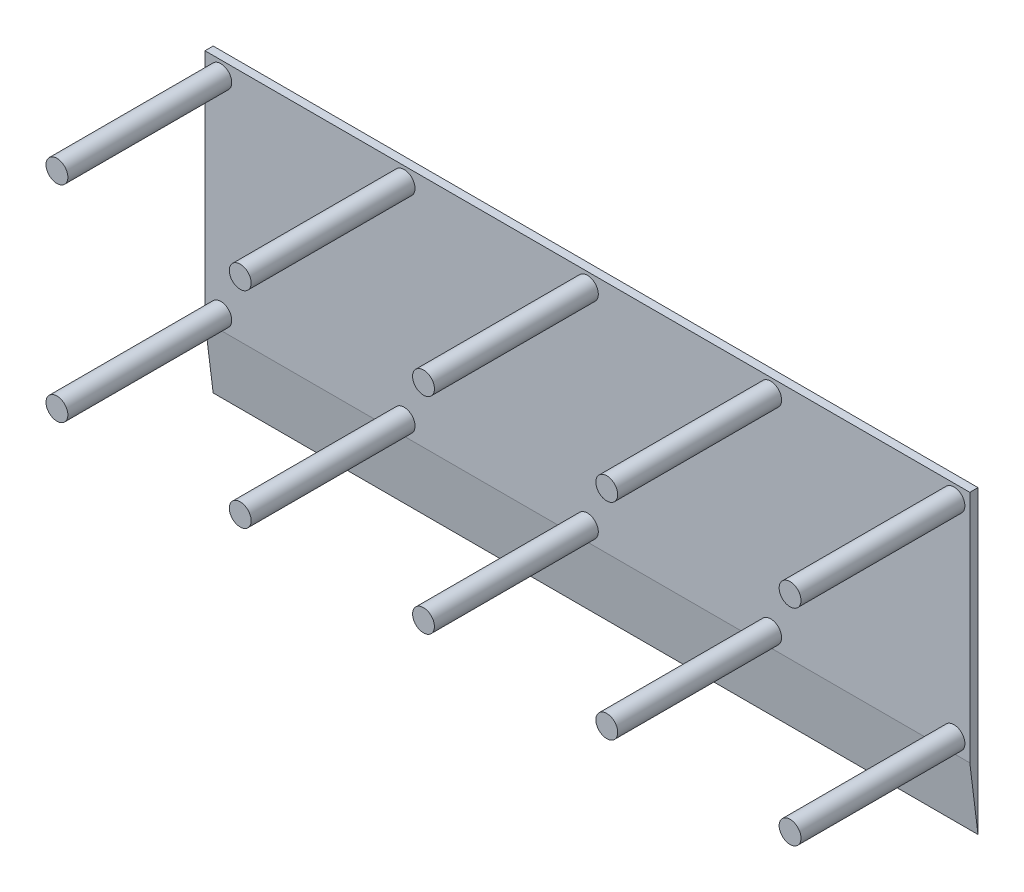
ISO-10303-21;
HEADER;
FILE_DESCRIPTION(('STEP AP214'),'2;1');
FILE_NAME('part.step','',(''),(''),'','','');
FILE_SCHEMA(('AUTOMOTIVE_DESIGN { 1 0 10303 214 1 1 1 1 }'));
ENDSEC;
DATA;
#1=APPLICATION_CONTEXT('core data for automotive mechanical design processes');
#2=APPLICATION_PROTOCOL_DEFINITION('international standard','automotive_design',2000,#1);
#3=PRODUCT_CONTEXT('',#1,'mechanical');
#4=PRODUCT('Part','Part','',(#3));
#5=PRODUCT_RELATED_PRODUCT_CATEGORY('part','',(#4));
#6=PRODUCT_DEFINITION_FORMATION('','',#4);
#7=PRODUCT_DEFINITION_CONTEXT('part definition',#1,'design');
#8=PRODUCT_DEFINITION('design','',#6,#7);
#9=PRODUCT_DEFINITION_SHAPE('','',#8);
#10=(LENGTH_UNIT() NAMED_UNIT(*) SI_UNIT(.MILLI.,.METRE.));
#11=(NAMED_UNIT(*) PLANE_ANGLE_UNIT() SI_UNIT($,.RADIAN.));
#12=(NAMED_UNIT(*) SI_UNIT($,.STERADIAN.) SOLID_ANGLE_UNIT());
#13=UNCERTAINTY_MEASURE_WITH_UNIT(LENGTH_MEASURE(1.E-05),#10,'distance_accuracy_value','');
#14=(GEOMETRIC_REPRESENTATION_CONTEXT(3) GLOBAL_UNCERTAINTY_ASSIGNED_CONTEXT((#13)) GLOBAL_UNIT_ASSIGNED_CONTEXT((#10,
#11,#12)) REPRESENTATION_CONTEXT('',''));
#15=CARTESIAN_POINT('',(0.,0.,0.));
#16=DIRECTION('',(0.,0.,1.));
#17=DIRECTION('',(1.,0.,0.));
#18=AXIS2_PLACEMENT_3D('',#15,#16,#17);
#19=CARTESIAN_POINT('',(-140.,-55.,3.));
#20=DIRECTION('',(-1.,0.,0.));
#21=DIRECTION('',(0.,0.,1.));
#22=AXIS2_PLACEMENT_3D('',#19,#20,#21);
#23=PLANE('',#22);
#24=DIRECTION('',(0.,-0.992425846667638,-0.122845182510434));
#25=VECTOR('',#24,1.);
#26=CARTESIAN_POINT('',(-140.,-55.,0.));
#27=LINE('',#26,#25);
#28=CARTESIAN_POINT('',(-140.,-30.7639861884691,3.));
#29=VERTEX_POINT('',#28);
#30=CARTESIAN_POINT('',(-140.,-55.,0.));
#31=VERTEX_POINT('',#30);
#32=EDGE_CURVE('E70',#29,#31,#27,.T.);
#33=ORIENTED_EDGE('',*,*,#32,.F.);
#34=DIRECTION('',(0.,1.,0.));
#35=VECTOR('',#34,1.);
#36=CARTESIAN_POINT('',(-140.,-55.,3.));
#37=LINE('',#36,#35);
#38=CARTESIAN_POINT('',(-140.,55.,3.));
#39=VERTEX_POINT('',#38);
#40=EDGE_CURVE('E91',#29,#39,#37,.T.);
#41=ORIENTED_EDGE('',*,*,#40,.T.);
#42=DIRECTION('',(0.,0.,-1.));
#43=VECTOR('',#42,1.);
#44=CARTESIAN_POINT('',(-140.,55.,3.));
#45=LINE('',#44,#43);
#46=CARTESIAN_POINT('',(-140.,55.,0.));
#47=VERTEX_POINT('',#46);
#48=EDGE_CURVE('E94',#39,#47,#45,.T.);
#49=ORIENTED_EDGE('',*,*,#48,.T.);
#50=DIRECTION('',(0.,1.,0.));
#51=VECTOR('',#50,1.);
#52=CARTESIAN_POINT('',(-140.,-55.,0.));
#53=LINE('',#52,#51);
#54=EDGE_CURVE('E89',#31,#47,#53,.T.);
#55=ORIENTED_EDGE('',*,*,#54,.F.);
#56=EDGE_LOOP('',(#33,#41,#49,#55));
#57=FACE_BOUND('',#56,.T.);
#58=ADVANCED_FACE('F33',(#57),#23,.T.);
#59=CARTESIAN_POINT('',(140.,-55.,3.));
#60=DIRECTION('',(-1.,0.,0.));
#61=DIRECTION('',(0.,0.,1.));
#62=AXIS2_PLACEMENT_3D('',#59,#60,#61);
#63=PLANE('',#62);
#64=DIRECTION('',(0.,1.,0.));
#65=VECTOR('',#64,1.);
#66=CARTESIAN_POINT('',(140.,-55.,3.));
#67=LINE('',#66,#65);
#68=CARTESIAN_POINT('',(140.,-30.7639861884692,3.));
#69=VERTEX_POINT('',#68);
#70=CARTESIAN_POINT('',(140.,55.,3.));
#71=VERTEX_POINT('',#70);
#72=EDGE_CURVE('E49',#69,#71,#67,.T.);
#73=ORIENTED_EDGE('',*,*,#72,.F.);
#74=DIRECTION('',(0.,0.992425846667638,0.122845182510434));
#75=VECTOR('',#74,1.);
#76=CARTESIAN_POINT('',(140.,-55.,0.));
#77=LINE('',#76,#75);
#78=CARTESIAN_POINT('',(140.,-55.,0.));
#79=VERTEX_POINT('',#78);
#80=EDGE_CURVE('E81',#79,#69,#77,.T.);
#81=ORIENTED_EDGE('',*,*,#80,.F.);
#82=DIRECTION('',(0.,1.,0.));
#83=VECTOR('',#82,1.);
#84=CARTESIAN_POINT('',(140.,-55.,0.));
#85=LINE('',#84,#83);
#86=CARTESIAN_POINT('',(140.,55.,0.));
#87=VERTEX_POINT('',#86);
#88=EDGE_CURVE('E90',#79,#87,#85,.T.);
#89=ORIENTED_EDGE('',*,*,#88,.T.);
#90=DIRECTION('',(0.,0.,-1.));
#91=VECTOR('',#90,1.);
#92=CARTESIAN_POINT('',(140.,55.,3.));
#93=LINE('',#92,#91);
#94=EDGE_CURVE('E63',#71,#87,#93,.T.);
#95=ORIENTED_EDGE('',*,*,#94,.F.);
#96=EDGE_LOOP('',(#73,#81,#89,#95));
#97=FACE_BOUND('',#96,.T.);
#98=ADVANCED_FACE('F205',(#97),#63,.F.);
#99=CARTESIAN_POINT('',(-140.,55.,3.));
#100=DIRECTION('',(0.,1.,0.));
#101=DIRECTION('',(0.,0.,1.));
#102=AXIS2_PLACEMENT_3D('',#99,#100,#101);
#103=PLANE('',#102);
#104=DIRECTION('',(1.,0.,0.));
#105=VECTOR('',#104,1.);
#106=CARTESIAN_POINT('',(-140.,55.,0.));
#107=LINE('',#106,#105);
#108=EDGE_CURVE('E95',#47,#87,#107,.T.);
#109=ORIENTED_EDGE('',*,*,#108,.F.);
#110=ORIENTED_EDGE('',*,*,#48,.F.);
#111=DIRECTION('',(1.,0.,0.));
#112=VECTOR('',#111,1.);
#113=CARTESIAN_POINT('',(-140.,55.,3.));
#114=LINE('',#113,#112);
#115=EDGE_CURVE('E155',#39,#71,#114,.T.);
#116=ORIENTED_EDGE('',*,*,#115,.T.);
#117=ORIENTED_EDGE('',*,*,#94,.T.);
#118=EDGE_LOOP('',(#109,#110,#116,#117));
#119=FACE_BOUND('',#118,.T.);
#120=ADVANCED_FACE('F136',(#119),#103,.T.);
#121=CARTESIAN_POINT('',(0.,0.,3.));
#122=DIRECTION('',(0.,0.,-1.));
#123=DIRECTION('',(-1.,0.,0.));
#124=AXIS2_PLACEMENT_3D('',#121,#122,#123);
#125=PLANE('',#124);
#126=CARTESIAN_POINT('',(134.2,-25.5639861884691,3.));
#127=DIRECTION('',(0.,0.,-1.));
#128=DIRECTION('',(-1.,0.,0.));
#129=AXIS2_PLACEMENT_3D('',#126,#127,#128);
#130=CIRCLE('',#129,3.99999999999999);
#131=CARTESIAN_POINT('',(130.2,-25.5639861884691,3.));
#132=VERTEX_POINT('',#131);
#133=EDGE_CURVE('E11',#132,#132,#130,.F.);
#134=ORIENTED_EDGE('',*,*,#133,.F.);
#135=EDGE_LOOP('',(#134));
#136=FACE_BOUND('',#135,.T.);
#137=CARTESIAN_POINT('',(67.1000000000001,-25.5639861884691,3.));
#138=DIRECTION('',(0.,0.,-1.));
#139=DIRECTION('',(-1.,0.,0.));
#140=AXIS2_PLACEMENT_3D('',#137,#138,#139);
#141=CIRCLE('',#140,4.00000000000001);
#142=CARTESIAN_POINT('',(63.1000000000001,-25.5639861884691,3.));
#143=VERTEX_POINT('',#142);
#144=EDGE_CURVE('E41',#143,#143,#141,.F.);
#145=ORIENTED_EDGE('',*,*,#144,.F.);
#146=EDGE_LOOP('',(#145));
#147=FACE_BOUND('',#146,.T.);
#148=CARTESIAN_POINT('',(0.,-25.5639861884692,3.));
#149=DIRECTION('',(0.,0.,-1.));
#150=DIRECTION('',(-1.,0.,0.));
#151=AXIS2_PLACEMENT_3D('',#148,#149,#150);
#152=CIRCLE('',#151,4.);
#153=CARTESIAN_POINT('',(-3.99999999999998,-25.5639861884692,3.));
#154=VERTEX_POINT('',#153);
#155=EDGE_CURVE('E126',#154,#154,#152,.F.);
#156=ORIENTED_EDGE('',*,*,#155,.F.);
#157=EDGE_LOOP('',(#156));
#158=FACE_BOUND('',#157,.T.);
#159=CARTESIAN_POINT('',(-67.1,-25.5639861884692,3.));
#160=DIRECTION('',(0.,0.,-1.));
#161=DIRECTION('',(-1.,0.,0.));
#162=AXIS2_PLACEMENT_3D('',#159,#160,#161);
#163=CIRCLE('',#162,4.00000000000001);
#164=CARTESIAN_POINT('',(-71.1,-25.5639861884692,3.));
#165=VERTEX_POINT('',#164);
#166=EDGE_CURVE('E123',#165,#165,#163,.F.);
#167=ORIENTED_EDGE('',*,*,#166,.F.);
#168=EDGE_LOOP('',(#167));
#169=FACE_BOUND('',#168,.T.);
#170=CARTESIAN_POINT('',(-134.2,-25.5639861884692,3.));
#171=DIRECTION('',(0.,0.,-1.));
#172=DIRECTION('',(-1.,0.,0.));
#173=AXIS2_PLACEMENT_3D('',#170,#171,#172);
#174=CIRCLE('',#173,3.99999999999999);
#175=CARTESIAN_POINT('',(-138.2,-25.5639861884692,3.));
#176=VERTEX_POINT('',#175);
#177=EDGE_CURVE('E120',#176,#176,#174,.F.);
#178=ORIENTED_EDGE('',*,*,#177,.F.);
#179=EDGE_LOOP('',(#178));
#180=FACE_BOUND('',#179,.T.);
#181=CARTESIAN_POINT('',(-134.2,49.7999999999999,3.));
#182=DIRECTION('',(0.,0.,-1.));
#183=DIRECTION('',(-1.,0.,0.));
#184=AXIS2_PLACEMENT_3D('',#181,#182,#183);
#185=CIRCLE('',#184,3.99999999999999);
#186=CARTESIAN_POINT('',(-138.2,49.7999999999999,3.));
#187=VERTEX_POINT('',#186);
#188=EDGE_CURVE('E117',#187,#187,#185,.F.);
#189=ORIENTED_EDGE('',*,*,#188,.F.);
#190=EDGE_LOOP('',(#189));
#191=FACE_BOUND('',#190,.T.);
#192=CARTESIAN_POINT('',(-67.1,49.8,3.));
#193=DIRECTION('',(0.,0.,-1.));
#194=DIRECTION('',(-1.,0.,0.));
#195=AXIS2_PLACEMENT_3D('',#192,#193,#194);
#196=CIRCLE('',#195,4.00000000000001);
#197=CARTESIAN_POINT('',(-71.1,49.8,3.));
#198=VERTEX_POINT('',#197);
#199=EDGE_CURVE('E114',#198,#198,#196,.F.);
#200=ORIENTED_EDGE('',*,*,#199,.F.);
#201=EDGE_LOOP('',(#200));
#202=FACE_BOUND('',#201,.T.);
#203=CARTESIAN_POINT('',(0.,49.8,3.));
#204=DIRECTION('',(0.,0.,-1.));
#205=DIRECTION('',(-1.,0.,0.));
#206=AXIS2_PLACEMENT_3D('',#203,#204,#205);
#207=CIRCLE('',#206,4.);
#208=CARTESIAN_POINT('',(-4.00000000000002,49.8,3.));
#209=VERTEX_POINT('',#208);
#210=EDGE_CURVE('E111',#209,#209,#207,.F.);
#211=ORIENTED_EDGE('',*,*,#210,.F.);
#212=EDGE_LOOP('',(#211));
#213=FACE_BOUND('',#212,.T.);
#214=CARTESIAN_POINT('',(67.1000000000001,49.8,3.));
#215=DIRECTION('',(0.,0.,-1.));
#216=DIRECTION('',(-1.,0.,0.));
#217=AXIS2_PLACEMENT_3D('',#214,#215,#216);
#218=CIRCLE('',#217,4.00000000000001);
#219=CARTESIAN_POINT('',(63.1,49.8,3.));
#220=VERTEX_POINT('',#219);
#221=EDGE_CURVE('E108',#220,#220,#218,.F.);
#222=ORIENTED_EDGE('',*,*,#221,.F.);
#223=EDGE_LOOP('',(#222));
#224=FACE_BOUND('',#223,.T.);
#225=CARTESIAN_POINT('',(134.2,49.8,3.));
#226=DIRECTION('',(0.,0.,-1.));
#227=DIRECTION('',(-1.,0.,0.));
#228=AXIS2_PLACEMENT_3D('',#225,#226,#227);
#229=CIRCLE('',#228,3.99999999999999);
#230=CARTESIAN_POINT('',(130.2,49.8,3.));
#231=VERTEX_POINT('',#230);
#232=EDGE_CURVE('E104',#231,#231,#229,.F.);
#233=ORIENTED_EDGE('',*,*,#232,.F.);
#234=EDGE_LOOP('',(#233));
#235=FACE_BOUND('',#234,.T.);
#236=ORIENTED_EDGE('',*,*,#40,.F.);
#237=DIRECTION('',(1.,0.,0.));
#238=VECTOR('',#237,1.);
#239=CARTESIAN_POINT('',(0.,-30.7639861884691,3.));
#240=LINE('',#239,#238);
#241=EDGE_CURVE('E77',#29,#69,#240,.T.);
#242=ORIENTED_EDGE('',*,*,#241,.T.);
#243=ORIENTED_EDGE('',*,*,#72,.T.);
#244=ORIENTED_EDGE('',*,*,#115,.F.);
#245=EDGE_LOOP('',(#236,#242,#243,#244));
#246=FACE_BOUND('',#245,.T.);
#247=ADVANCED_FACE('F133',(#136,#147,#158,#169,#180,#191,#202,#213,#224,#235,#246),#125,.F.);
#248=CARTESIAN_POINT('',(0.,0.,0.));
#249=DIRECTION('',(0.,0.,-1.));
#250=DIRECTION('',(-1.,0.,0.));
#251=AXIS2_PLACEMENT_3D('',#248,#249,#250);
#252=PLANE('',#251);
#253=ORIENTED_EDGE('',*,*,#54,.T.);
#254=ORIENTED_EDGE('',*,*,#108,.T.);
#255=ORIENTED_EDGE('',*,*,#88,.F.);
#256=DIRECTION('',(1.,0.,0.));
#257=VECTOR('',#256,1.);
#258=CARTESIAN_POINT('',(-140.,-55.,0.));
#259=LINE('',#258,#257);
#260=EDGE_CURVE('E75',#31,#79,#259,.T.);
#261=ORIENTED_EDGE('',*,*,#260,.F.);
#262=EDGE_LOOP('',(#253,#254,#255,#261));
#263=FACE_BOUND('',#262,.T.);
#264=ADVANCED_FACE('F87',(#263),#252,.T.);
#265=CARTESIAN_POINT('',(164.616448757387,-55.,0.));
#266=DIRECTION('',(0.,0.122845182510434,-0.992425846667638));
#267=DIRECTION('',(0.,0.992425846667638,0.122845182510434));
#268=AXIS2_PLACEMENT_3D('',#265,#266,#267);
#269=PLANE('',#268);
#270=ORIENTED_EDGE('',*,*,#32,.T.);
#271=ORIENTED_EDGE('',*,*,#260,.T.);
#272=ORIENTED_EDGE('',*,*,#80,.T.);
#273=ORIENTED_EDGE('',*,*,#241,.F.);
#274=EDGE_LOOP('',(#270,#271,#272,#273));
#275=FACE_BOUND('',#274,.T.);
#276=ADVANCED_FACE('F72',(#275),#269,.F.);
#277=CARTESIAN_POINT('',(134.2,49.8,63.));
#278=DIRECTION('',(0.,0.,-1.));
#279=DIRECTION('',(-1.,0.,0.));
#280=AXIS2_PLACEMENT_3D('',#277,#278,#279);
#281=CYLINDRICAL_SURFACE('',#280,3.99999999999999);
#282=CARTESIAN_POINT('',(134.2,49.8,63.));
#283=DIRECTION('',(0.,0.,1.));
#284=DIRECTION('',(1.,0.,0.));
#285=AXIS2_PLACEMENT_3D('',#282,#283,#284);
#286=CIRCLE('',#285,3.99999999999999);
#287=CARTESIAN_POINT('',(138.2,49.8,63.));
#288=VERTEX_POINT('',#287);
#289=EDGE_CURVE('E82',#288,#288,#286,.T.);
#290=ORIENTED_EDGE('',*,*,#289,.F.);
#291=EDGE_LOOP('',(#290));
#292=FACE_BOUND('',#291,.T.);
#293=ORIENTED_EDGE('',*,*,#232,.T.);
#294=EDGE_LOOP('',(#293));
#295=FACE_BOUND('',#294,.T.);
#296=ADVANCED_FACE('F219',(#292,#295),#281,.T.);
#297=CARTESIAN_POINT('',(134.2,49.8,63.));
#298=DIRECTION('',(0.,0.,1.));
#299=DIRECTION('',(1.,0.,0.));
#300=AXIS2_PLACEMENT_3D('',#297,#298,#299);
#301=PLANE('',#300);
#302=ORIENTED_EDGE('',*,*,#289,.T.);
#303=EDGE_LOOP('',(#302));
#304=FACE_BOUND('',#303,.T.);
#305=ADVANCED_FACE('F222',(#304),#301,.T.);
#306=CARTESIAN_POINT('',(67.1000000000001,49.8,63.));
#307=DIRECTION('',(0.,0.,-1.));
#308=DIRECTION('',(-1.,0.,0.));
#309=AXIS2_PLACEMENT_3D('',#306,#307,#308);
#310=CYLINDRICAL_SURFACE('',#309,4.00000000000001);
#311=CARTESIAN_POINT('',(67.1000000000001,49.8,63.));
#312=DIRECTION('',(0.,0.,1.));
#313=DIRECTION('',(1.,0.,0.));
#314=AXIS2_PLACEMENT_3D('',#311,#312,#313);
#315=CIRCLE('',#314,4.00000000000001);
#316=CARTESIAN_POINT('',(71.1000000000001,49.8,63.));
#317=VERTEX_POINT('',#316);
#318=EDGE_CURVE('E161',#317,#317,#315,.T.);
#319=ORIENTED_EDGE('',*,*,#318,.F.);
#320=EDGE_LOOP('',(#319));
#321=FACE_BOUND('',#320,.T.);
#322=ORIENTED_EDGE('',*,*,#221,.T.);
#323=EDGE_LOOP('',(#322));
#324=FACE_BOUND('',#323,.T.);
#325=ADVANCED_FACE('F226',(#321,#324),#310,.T.);
#326=CARTESIAN_POINT('',(67.1000000000001,49.8,63.));
#327=DIRECTION('',(0.,0.,1.));
#328=DIRECTION('',(1.,0.,0.));
#329=AXIS2_PLACEMENT_3D('',#326,#327,#328);
#330=PLANE('',#329);
#331=ORIENTED_EDGE('',*,*,#318,.T.);
#332=EDGE_LOOP('',(#331));
#333=FACE_BOUND('',#332,.T.);
#334=ADVANCED_FACE('F230',(#333),#330,.T.);
#335=CARTESIAN_POINT('',(0.,49.8,63.));
#336=DIRECTION('',(0.,0.,-1.));
#337=DIRECTION('',(-1.,0.,0.));
#338=AXIS2_PLACEMENT_3D('',#335,#336,#337);
#339=CYLINDRICAL_SURFACE('',#338,4.);
#340=CARTESIAN_POINT('',(0.,49.8,63.));
#341=DIRECTION('',(0.,0.,1.));
#342=DIRECTION('',(1.,0.,0.));
#343=AXIS2_PLACEMENT_3D('',#340,#341,#342);
#344=CIRCLE('',#343,4.);
#345=CARTESIAN_POINT('',(3.99999999999998,49.8,63.));
#346=VERTEX_POINT('',#345);
#347=EDGE_CURVE('E164',#346,#346,#344,.T.);
#348=ORIENTED_EDGE('',*,*,#347,.F.);
#349=EDGE_LOOP('',(#348));
#350=FACE_BOUND('',#349,.T.);
#351=ORIENTED_EDGE('',*,*,#210,.T.);
#352=EDGE_LOOP('',(#351));
#353=FACE_BOUND('',#352,.T.);
#354=ADVANCED_FACE('F234',(#350,#353),#339,.T.);
#355=CARTESIAN_POINT('',(0.,49.8,63.));
#356=DIRECTION('',(0.,0.,1.));
#357=DIRECTION('',(1.,0.,0.));
#358=AXIS2_PLACEMENT_3D('',#355,#356,#357);
#359=PLANE('',#358);
#360=ORIENTED_EDGE('',*,*,#347,.T.);
#361=EDGE_LOOP('',(#360));
#362=FACE_BOUND('',#361,.T.);
#363=ADVANCED_FACE('F238',(#362),#359,.T.);
#364=CARTESIAN_POINT('',(-67.1,49.8,63.));
#365=DIRECTION('',(0.,0.,-1.));
#366=DIRECTION('',(-1.,0.,0.));
#367=AXIS2_PLACEMENT_3D('',#364,#365,#366);
#368=CYLINDRICAL_SURFACE('',#367,4.00000000000001);
#369=CARTESIAN_POINT('',(-67.1,49.8,63.));
#370=DIRECTION('',(0.,0.,1.));
#371=DIRECTION('',(1.,0.,0.));
#372=AXIS2_PLACEMENT_3D('',#369,#370,#371);
#373=CIRCLE('',#372,4.00000000000001);
#374=CARTESIAN_POINT('',(-63.1,49.8,63.));
#375=VERTEX_POINT('',#374);
#376=EDGE_CURVE('E167',#375,#375,#373,.T.);
#377=ORIENTED_EDGE('',*,*,#376,.F.);
#378=EDGE_LOOP('',(#377));
#379=FACE_BOUND('',#378,.T.);
#380=ORIENTED_EDGE('',*,*,#199,.T.);
#381=EDGE_LOOP('',(#380));
#382=FACE_BOUND('',#381,.T.);
#383=ADVANCED_FACE('F242',(#379,#382),#368,.T.);
#384=CARTESIAN_POINT('',(-67.1,49.8,63.));
#385=DIRECTION('',(0.,0.,1.));
#386=DIRECTION('',(1.,0.,0.));
#387=AXIS2_PLACEMENT_3D('',#384,#385,#386);
#388=PLANE('',#387);
#389=ORIENTED_EDGE('',*,*,#376,.T.);
#390=EDGE_LOOP('',(#389));
#391=FACE_BOUND('',#390,.T.);
#392=ADVANCED_FACE('F246',(#391),#388,.T.);
#393=CARTESIAN_POINT('',(-134.2,49.7999999999999,63.));
#394=DIRECTION('',(0.,0.,-1.));
#395=DIRECTION('',(-1.,0.,0.));
#396=AXIS2_PLACEMENT_3D('',#393,#394,#395);
#397=CYLINDRICAL_SURFACE('',#396,3.99999999999999);
#398=CARTESIAN_POINT('',(-134.2,49.7999999999999,63.));
#399=DIRECTION('',(0.,0.,1.));
#400=DIRECTION('',(1.,0.,0.));
#401=AXIS2_PLACEMENT_3D('',#398,#399,#400);
#402=CIRCLE('',#401,3.99999999999999);
#403=CARTESIAN_POINT('',(-130.2,49.7999999999999,63.));
#404=VERTEX_POINT('',#403);
#405=EDGE_CURVE('E170',#404,#404,#402,.T.);
#406=ORIENTED_EDGE('',*,*,#405,.F.);
#407=EDGE_LOOP('',(#406));
#408=FACE_BOUND('',#407,.T.);
#409=ORIENTED_EDGE('',*,*,#188,.T.);
#410=EDGE_LOOP('',(#409));
#411=FACE_BOUND('',#410,.T.);
#412=ADVANCED_FACE('F250',(#408,#411),#397,.T.);
#413=CARTESIAN_POINT('',(-134.2,49.7999999999999,63.));
#414=DIRECTION('',(0.,0.,1.));
#415=DIRECTION('',(1.,0.,0.));
#416=AXIS2_PLACEMENT_3D('',#413,#414,#415);
#417=PLANE('',#416);
#418=ORIENTED_EDGE('',*,*,#405,.T.);
#419=EDGE_LOOP('',(#418));
#420=FACE_BOUND('',#419,.T.);
#421=ADVANCED_FACE('F254',(#420),#417,.T.);
#422=CARTESIAN_POINT('',(-134.2,-25.5639861884692,63.));
#423=DIRECTION('',(0.,0.,-1.));
#424=DIRECTION('',(-1.,0.,0.));
#425=AXIS2_PLACEMENT_3D('',#422,#423,#424);
#426=CYLINDRICAL_SURFACE('',#425,3.99999999999999);
#427=CARTESIAN_POINT('',(-134.2,-25.5639861884692,63.));
#428=DIRECTION('',(0.,0.,1.));
#429=DIRECTION('',(1.,0.,0.));
#430=AXIS2_PLACEMENT_3D('',#427,#428,#429);
#431=CIRCLE('',#430,3.99999999999999);
#432=CARTESIAN_POINT('',(-130.2,-25.5639861884692,63.));
#433=VERTEX_POINT('',#432);
#434=EDGE_CURVE('E173',#433,#433,#431,.T.);
#435=ORIENTED_EDGE('',*,*,#434,.F.);
#436=EDGE_LOOP('',(#435));
#437=FACE_BOUND('',#436,.T.);
#438=ORIENTED_EDGE('',*,*,#177,.T.);
#439=EDGE_LOOP('',(#438));
#440=FACE_BOUND('',#439,.T.);
#441=ADVANCED_FACE('F258',(#437,#440),#426,.T.);
#442=CARTESIAN_POINT('',(-134.2,-25.5639861884692,63.));
#443=DIRECTION('',(0.,0.,1.));
#444=DIRECTION('',(1.,0.,0.));
#445=AXIS2_PLACEMENT_3D('',#442,#443,#444);
#446=PLANE('',#445);
#447=ORIENTED_EDGE('',*,*,#434,.T.);
#448=EDGE_LOOP('',(#447));
#449=FACE_BOUND('',#448,.T.);
#450=ADVANCED_FACE('F262',(#449),#446,.T.);
#451=CARTESIAN_POINT('',(-67.1,-25.5639861884692,63.));
#452=DIRECTION('',(0.,0.,-1.));
#453=DIRECTION('',(-1.,0.,0.));
#454=AXIS2_PLACEMENT_3D('',#451,#452,#453);
#455=CYLINDRICAL_SURFACE('',#454,4.00000000000001);
#456=CARTESIAN_POINT('',(-67.1,-25.5639861884692,63.));
#457=DIRECTION('',(0.,0.,1.));
#458=DIRECTION('',(1.,0.,0.));
#459=AXIS2_PLACEMENT_3D('',#456,#457,#458);
#460=CIRCLE('',#459,4.00000000000001);
#461=CARTESIAN_POINT('',(-63.1,-25.5639861884692,63.));
#462=VERTEX_POINT('',#461);
#463=EDGE_CURVE('E176',#462,#462,#460,.T.);
#464=ORIENTED_EDGE('',*,*,#463,.F.);
#465=EDGE_LOOP('',(#464));
#466=FACE_BOUND('',#465,.T.);
#467=ORIENTED_EDGE('',*,*,#166,.T.);
#468=EDGE_LOOP('',(#467));
#469=FACE_BOUND('',#468,.T.);
#470=ADVANCED_FACE('F266',(#466,#469),#455,.T.);
#471=CARTESIAN_POINT('',(-67.1,-25.5639861884692,63.));
#472=DIRECTION('',(0.,0.,1.));
#473=DIRECTION('',(1.,0.,0.));
#474=AXIS2_PLACEMENT_3D('',#471,#472,#473);
#475=PLANE('',#474);
#476=ORIENTED_EDGE('',*,*,#463,.T.);
#477=EDGE_LOOP('',(#476));
#478=FACE_BOUND('',#477,.T.);
#479=ADVANCED_FACE('F270',(#478),#475,.T.);
#480=CARTESIAN_POINT('',(0.,-25.5639861884692,63.));
#481=DIRECTION('',(0.,0.,-1.));
#482=DIRECTION('',(-1.,0.,0.));
#483=AXIS2_PLACEMENT_3D('',#480,#481,#482);
#484=CYLINDRICAL_SURFACE('',#483,4.);
#485=CARTESIAN_POINT('',(0.,-25.5639861884692,63.));
#486=DIRECTION('',(0.,0.,1.));
#487=DIRECTION('',(1.,0.,0.));
#488=AXIS2_PLACEMENT_3D('',#485,#486,#487);
#489=CIRCLE('',#488,4.);
#490=CARTESIAN_POINT('',(4.00000000000002,-25.5639861884692,63.));
#491=VERTEX_POINT('',#490);
#492=EDGE_CURVE('E179',#491,#491,#489,.T.);
#493=ORIENTED_EDGE('',*,*,#492,.F.);
#494=EDGE_LOOP('',(#493));
#495=FACE_BOUND('',#494,.T.);
#496=ORIENTED_EDGE('',*,*,#155,.T.);
#497=EDGE_LOOP('',(#496));
#498=FACE_BOUND('',#497,.T.);
#499=ADVANCED_FACE('F274',(#495,#498),#484,.T.);
#500=CARTESIAN_POINT('',(0.,-25.5639861884692,63.));
#501=DIRECTION('',(0.,0.,1.));
#502=DIRECTION('',(1.,0.,0.));
#503=AXIS2_PLACEMENT_3D('',#500,#501,#502);
#504=PLANE('',#503);
#505=ORIENTED_EDGE('',*,*,#492,.T.);
#506=EDGE_LOOP('',(#505));
#507=FACE_BOUND('',#506,.T.);
#508=ADVANCED_FACE('F278',(#507),#504,.T.);
#509=CARTESIAN_POINT('',(67.1000000000001,-25.5639861884691,63.));
#510=DIRECTION('',(0.,0.,-1.));
#511=DIRECTION('',(-1.,0.,0.));
#512=AXIS2_PLACEMENT_3D('',#509,#510,#511);
#513=CYLINDRICAL_SURFACE('',#512,4.00000000000001);
#514=CARTESIAN_POINT('',(67.1000000000001,-25.5639861884691,63.));
#515=DIRECTION('',(0.,0.,1.));
#516=DIRECTION('',(1.,0.,0.));
#517=AXIS2_PLACEMENT_3D('',#514,#515,#516);
#518=CIRCLE('',#517,4.00000000000001);
#519=CARTESIAN_POINT('',(71.1000000000001,-25.5639861884691,63.));
#520=VERTEX_POINT('',#519);
#521=EDGE_CURVE('E182',#520,#520,#518,.T.);
#522=ORIENTED_EDGE('',*,*,#521,.F.);
#523=EDGE_LOOP('',(#522));
#524=FACE_BOUND('',#523,.T.);
#525=ORIENTED_EDGE('',*,*,#144,.T.);
#526=EDGE_LOOP('',(#525));
#527=FACE_BOUND('',#526,.T.);
#528=ADVANCED_FACE('F131',(#524,#527),#513,.T.);
#529=CARTESIAN_POINT('',(67.1000000000001,-25.5639861884691,63.));
#530=DIRECTION('',(0.,0.,1.));
#531=DIRECTION('',(1.,0.,0.));
#532=AXIS2_PLACEMENT_3D('',#529,#530,#531);
#533=PLANE('',#532);
#534=ORIENTED_EDGE('',*,*,#521,.T.);
#535=EDGE_LOOP('',(#534));
#536=FACE_BOUND('',#535,.T.);
#537=ADVANCED_FACE('F194',(#536),#533,.T.);
#538=CARTESIAN_POINT('',(134.2,-25.5639861884691,63.));
#539=DIRECTION('',(0.,0.,-1.));
#540=DIRECTION('',(-1.,0.,0.));
#541=AXIS2_PLACEMENT_3D('',#538,#539,#540);
#542=CYLINDRICAL_SURFACE('',#541,3.99999999999999);
#543=CARTESIAN_POINT('',(134.2,-25.5639861884691,63.));
#544=DIRECTION('',(0.,0.,1.));
#545=DIRECTION('',(1.,0.,0.));
#546=AXIS2_PLACEMENT_3D('',#543,#544,#545);
#547=CIRCLE('',#546,3.99999999999999);
#548=CARTESIAN_POINT('',(138.2,-25.5639861884691,63.));
#549=VERTEX_POINT('',#548);
#550=EDGE_CURVE('E185',#549,#549,#547,.T.);
#551=ORIENTED_EDGE('',*,*,#550,.F.);
#552=EDGE_LOOP('',(#551));
#553=FACE_BOUND('',#552,.T.);
#554=ORIENTED_EDGE('',*,*,#133,.T.);
#555=EDGE_LOOP('',(#554));
#556=FACE_BOUND('',#555,.T.);
#557=ADVANCED_FACE('F191',(#553,#556),#542,.T.);
#558=CARTESIAN_POINT('',(134.2,-25.5639861884691,63.));
#559=DIRECTION('',(0.,0.,1.));
#560=DIRECTION('',(1.,0.,0.));
#561=AXIS2_PLACEMENT_3D('',#558,#559,#560);
#562=PLANE('',#561);
#563=ORIENTED_EDGE('',*,*,#550,.T.);
#564=EDGE_LOOP('',(#563));
#565=FACE_BOUND('',#564,.T.);
#566=ADVANCED_FACE('F189',(#565),#562,.T.);
#567=CLOSED_SHELL('',(#58,#98,#120,#247,#264,#276,#296,#305,#325,#334,#354,#363,#383,#392,#412,
#421,#441,#450,#470,#479,#499,#508,#528,#537,#557,#566));
#568=MANIFOLD_SOLID_BREP('B2',#567);
#569=ADVANCED_BREP_SHAPE_REPRESENTATION('',(#18,#568),#14);
#570=SHAPE_DEFINITION_REPRESENTATION(#9,#569);
ENDSEC;
END-ISO-10303-21;
